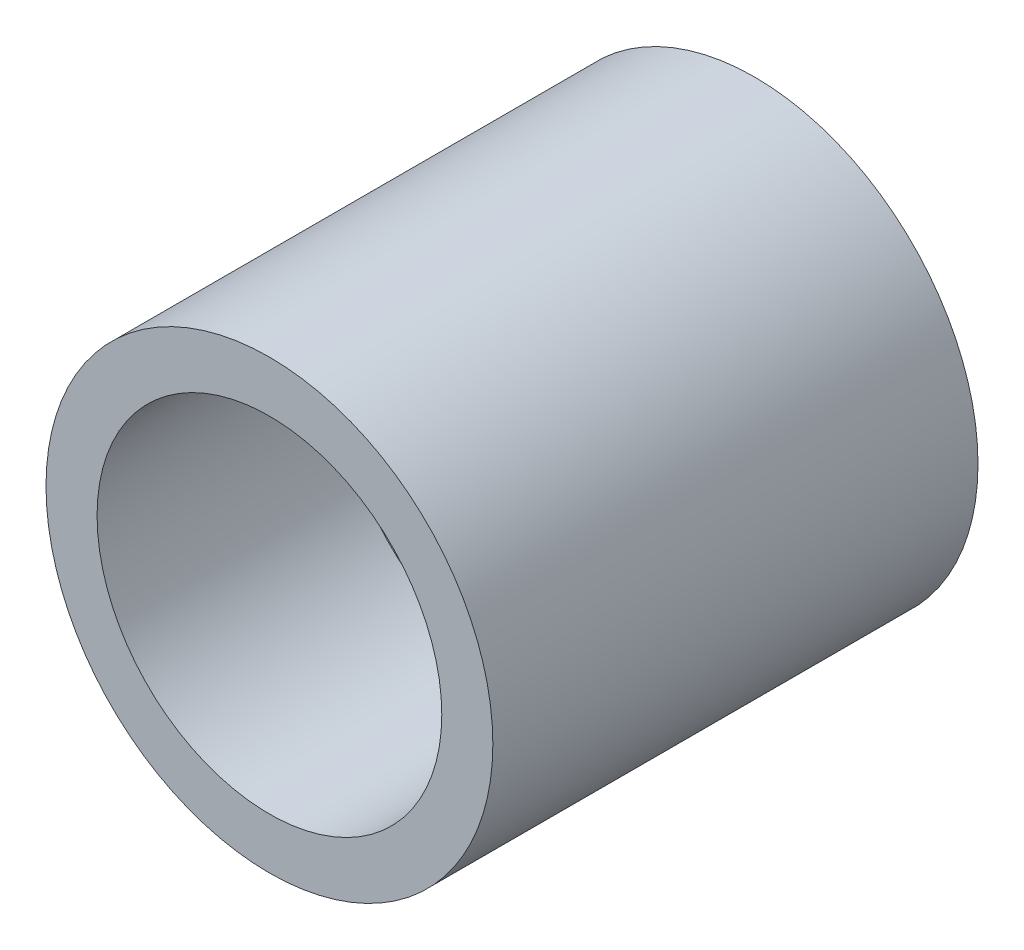
ISO-10303-21;
HEADER;
FILE_DESCRIPTION(('STEP AP214'),'2;1');
FILE_NAME('part.step','',(''),(''),'','','');
FILE_SCHEMA(('AUTOMOTIVE_DESIGN { 1 0 10303 214 1 1 1 1 }'));
ENDSEC;
DATA;
#1=APPLICATION_CONTEXT('core data for automotive mechanical design processes');
#2=APPLICATION_PROTOCOL_DEFINITION('international standard','automotive_design',2000,#1);
#3=PRODUCT_CONTEXT('',#1,'mechanical');
#4=PRODUCT('Part','Part','',(#3));
#5=PRODUCT_RELATED_PRODUCT_CATEGORY('part','',(#4));
#6=PRODUCT_DEFINITION_FORMATION('','',#4);
#7=PRODUCT_DEFINITION_CONTEXT('part definition',#1,'design');
#8=PRODUCT_DEFINITION('design','',#6,#7);
#9=PRODUCT_DEFINITION_SHAPE('','',#8);
#10=(LENGTH_UNIT() NAMED_UNIT(*) SI_UNIT(.MILLI.,.METRE.));
#11=(NAMED_UNIT(*) PLANE_ANGLE_UNIT() SI_UNIT($,.RADIAN.));
#12=(NAMED_UNIT(*) SI_UNIT($,.STERADIAN.) SOLID_ANGLE_UNIT());
#13=UNCERTAINTY_MEASURE_WITH_UNIT(LENGTH_MEASURE(1.E-05),#10,'distance_accuracy_value','');
#14=(GEOMETRIC_REPRESENTATION_CONTEXT(3) GLOBAL_UNCERTAINTY_ASSIGNED_CONTEXT((#13)) GLOBAL_UNIT_ASSIGNED_CONTEXT((#10,
#11,#12)) REPRESENTATION_CONTEXT('',''));
#15=CARTESIAN_POINT('',(0.,0.,0.));
#16=DIRECTION('',(0.,0.,1.));
#17=DIRECTION('',(1.,0.,0.));
#18=AXIS2_PLACEMENT_3D('',#15,#16,#17);
#19=CARTESIAN_POINT('',(0.,0.,0.));
#20=DIRECTION('',(0.,0.,-1.));
#21=DIRECTION('',(-1.,0.,0.));
#22=AXIS2_PLACEMENT_3D('',#19,#20,#21);
#23=CYLINDRICAL_SURFACE('',#22,17.5);
#24=CARTESIAN_POINT('',(0.,0.,0.));
#25=DIRECTION('',(0.,0.,1.));
#26=DIRECTION('',(1.,0.,0.));
#27=AXIS2_PLACEMENT_3D('',#24,#25,#26);
#28=CIRCLE('',#27,17.5);
#29=CARTESIAN_POINT('',(17.5,0.,0.));
#30=VERTEX_POINT('',#29);
#31=EDGE_CURVE('E34',#30,#30,#28,.T.);
#32=ORIENTED_EDGE('',*,*,#31,.F.);
#33=EDGE_LOOP('',(#32));
#34=FACE_BOUND('',#33,.T.);
#35=CARTESIAN_POINT('',(0.,0.,-38.));
#36=DIRECTION('',(0.,0.,-1.));
#37=DIRECTION('',(-1.,0.,0.));
#38=AXIS2_PLACEMENT_3D('',#35,#36,#37);
#39=CIRCLE('',#38,17.5);
#40=CARTESIAN_POINT('',(-17.5,0.,-38.));
#41=VERTEX_POINT('',#40);
#42=EDGE_CURVE('E44',#41,#41,#39,.T.);
#43=ORIENTED_EDGE('',*,*,#42,.F.);
#44=EDGE_LOOP('',(#43));
#45=FACE_BOUND('',#44,.T.);
#46=ADVANCED_FACE('F31',(#34,#45),#23,.T.);
#47=CARTESIAN_POINT('',(0.,0.,0.));
#48=DIRECTION('',(0.,0.,1.));
#49=DIRECTION('',(1.,0.,0.));
#50=AXIS2_PLACEMENT_3D('',#47,#48,#49);
#51=PLANE('',#50);
#52=CARTESIAN_POINT('',(0.,0.,0.));
#53=DIRECTION('',(0.,0.,1.));
#54=DIRECTION('',(1.,0.,0.));
#55=AXIS2_PLACEMENT_3D('',#52,#53,#54);
#56=CIRCLE('',#55,13.5);
#57=CARTESIAN_POINT('',(13.5,0.,0.));
#58=VERTEX_POINT('',#57);
#59=EDGE_CURVE('E10',#58,#58,#56,.F.);
#60=ORIENTED_EDGE('',*,*,#59,.T.);
#61=EDGE_LOOP('',(#60));
#62=FACE_BOUND('',#61,.T.);
#63=ORIENTED_EDGE('',*,*,#31,.T.);
#64=EDGE_LOOP('',(#63));
#65=FACE_BOUND('',#64,.T.);
#66=ADVANCED_FACE('F76',(#62,#65),#51,.T.);
#67=CARTESIAN_POINT('',(0.,0.,0.));
#68=DIRECTION('',(0.,0.,-1.));
#69=DIRECTION('',(-1.,0.,0.));
#70=AXIS2_PLACEMENT_3D('',#67,#68,#69);
#71=CYLINDRICAL_SURFACE('',#70,13.5);
#72=CARTESIAN_POINT('',(0.,0.,-19.));
#73=DIRECTION('',(0.,0.,1.));
#74=DIRECTION('',(1.,0.,0.));
#75=AXIS2_PLACEMENT_3D('',#72,#73,#74);
#76=CIRCLE('',#75,13.5);
#77=CARTESIAN_POINT('',(13.5,0.,-19.));
#78=VERTEX_POINT('',#77);
#79=EDGE_CURVE('E42',#78,#78,#76,.F.);
#80=ORIENTED_EDGE('',*,*,#79,.T.);
#81=EDGE_LOOP('',(#80));
#82=FACE_BOUND('',#81,.T.);
#83=ORIENTED_EDGE('',*,*,#59,.F.);
#84=EDGE_LOOP('',(#83));
#85=FACE_BOUND('',#84,.T.);
#86=ADVANCED_FACE('F73',(#82,#85),#71,.F.);
#87=CARTESIAN_POINT('',(0.,0.,-19.));
#88=DIRECTION('',(0.,0.,-1.));
#89=DIRECTION('',(-1.,0.,0.));
#90=AXIS2_PLACEMENT_3D('',#87,#88,#89);
#91=PLANE('',#90);
#92=CARTESIAN_POINT('',(0.,0.,-19.));
#93=DIRECTION('',(0.,0.,-1.));
#94=DIRECTION('',(-1.,0.,0.));
#95=AXIS2_PLACEMENT_3D('',#92,#93,#94);
#96=CIRCLE('',#95,11.5062);
#97=CARTESIAN_POINT('',(-11.5062,0.,-19.));
#98=VERTEX_POINT('',#97);
#99=EDGE_CURVE('E50',#98,#98,#96,.T.);
#100=ORIENTED_EDGE('',*,*,#99,.T.);
#101=EDGE_LOOP('',(#100));
#102=FACE_BOUND('',#101,.T.);
#103=ORIENTED_EDGE('',*,*,#79,.F.);
#104=EDGE_LOOP('',(#103));
#105=FACE_BOUND('',#104,.T.);
#106=ADVANCED_FACE('F65',(#102,#105),#91,.F.);
#107=CARTESIAN_POINT('',(0.,0.,-38.));
#108=DIRECTION('',(0.,0.,-1.));
#109=DIRECTION('',(-1.,0.,0.));
#110=AXIS2_PLACEMENT_3D('',#107,#108,#109);
#111=PLANE('',#110);
#112=CARTESIAN_POINT('',(0.,0.,-38.));
#113=DIRECTION('',(0.,0.,-1.));
#114=DIRECTION('',(-1.,0.,0.));
#115=AXIS2_PLACEMENT_3D('',#112,#113,#114);
#116=CIRCLE('',#115,11.5062);
#117=CARTESIAN_POINT('',(-11.5062,0.,-38.));
#118=VERTEX_POINT('',#117);
#119=EDGE_CURVE('E54',#118,#118,#116,.T.);
#120=ORIENTED_EDGE('',*,*,#119,.F.);
#121=EDGE_LOOP('',(#120));
#122=FACE_BOUND('',#121,.T.);
#123=ORIENTED_EDGE('',*,*,#42,.T.);
#124=EDGE_LOOP('',(#123));
#125=FACE_BOUND('',#124,.T.);
#126=ADVANCED_FACE('F63',(#122,#125),#111,.T.);
#127=CARTESIAN_POINT('',(0.,0.,-38.));
#128=DIRECTION('',(0.,0.,-1.));
#129=DIRECTION('',(-1.,0.,0.));
#130=AXIS2_PLACEMENT_3D('',#127,#128,#129);
#131=CYLINDRICAL_SURFACE('',#130,11.5062);
#132=ORIENTED_EDGE('',*,*,#99,.F.);
#133=EDGE_LOOP('',(#132));
#134=FACE_BOUND('',#133,.T.);
#135=ORIENTED_EDGE('',*,*,#119,.T.);
#136=EDGE_LOOP('',(#135));
#137=FACE_BOUND('',#136,.T.);
#138=ADVANCED_FACE('F61',(#134,#137),#131,.F.);
#139=CLOSED_SHELL('',(#46,#66,#86,#106,#126,#138));
#140=MANIFOLD_SOLID_BREP('B2',#139);
#141=ADVANCED_BREP_SHAPE_REPRESENTATION('',(#18,#140),#14);
#142=SHAPE_DEFINITION_REPRESENTATION(#9,#141);
ENDSEC;
END-ISO-10303-21;
